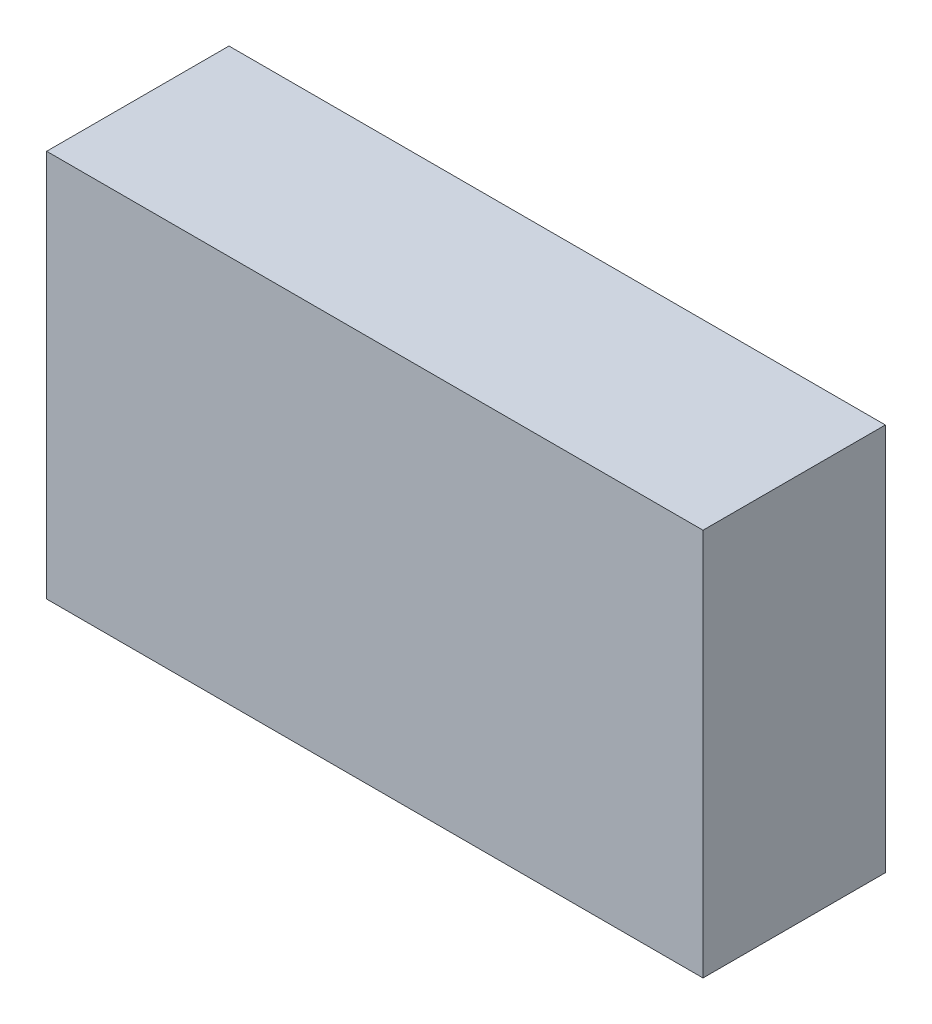
ISO-10303-21;
HEADER;
FILE_DESCRIPTION(('STEP AP214'),'2;1');
FILE_NAME('part.step','',(''),(''),'','','');
FILE_SCHEMA(('AUTOMOTIVE_DESIGN { 1 0 10303 214 1 1 1 1 }'));
ENDSEC;
DATA;
#1=APPLICATION_CONTEXT('core data for automotive mechanical design processes');
#2=APPLICATION_PROTOCOL_DEFINITION('international standard','automotive_design',2000,#1);
#3=PRODUCT_CONTEXT('',#1,'mechanical');
#4=PRODUCT('Part','Part','',(#3));
#5=PRODUCT_RELATED_PRODUCT_CATEGORY('part','',(#4));
#6=PRODUCT_DEFINITION_FORMATION('','',#4);
#7=PRODUCT_DEFINITION_CONTEXT('part definition',#1,'design');
#8=PRODUCT_DEFINITION('design','',#6,#7);
#9=PRODUCT_DEFINITION_SHAPE('','',#8);
#10=(LENGTH_UNIT() NAMED_UNIT(*) SI_UNIT(.MILLI.,.METRE.));
#11=(NAMED_UNIT(*) PLANE_ANGLE_UNIT() SI_UNIT($,.RADIAN.));
#12=(NAMED_UNIT(*) SI_UNIT($,.STERADIAN.) SOLID_ANGLE_UNIT());
#13=UNCERTAINTY_MEASURE_WITH_UNIT(LENGTH_MEASURE(1.E-05),#10,'distance_accuracy_value','');
#14=(GEOMETRIC_REPRESENTATION_CONTEXT(3) GLOBAL_UNCERTAINTY_ASSIGNED_CONTEXT((#13)) GLOBAL_UNIT_ASSIGNED_CONTEXT((#10,
#11,#12)) REPRESENTATION_CONTEXT('',''));
#15=CARTESIAN_POINT('',(0.,0.,0.));
#16=DIRECTION('',(0.,0.,1.));
#17=DIRECTION('',(1.,0.,0.));
#18=AXIS2_PLACEMENT_3D('',#15,#16,#17);
#19=CARTESIAN_POINT('',(-1.8,-1.0635,1.));
#20=DIRECTION('',(1.,0.,0.));
#21=DIRECTION('',(0.,0.,-1.));
#22=AXIS2_PLACEMENT_3D('',#19,#20,#21);
#23=PLANE('',#22);
#24=DIRECTION('',(0.,-1.,0.));
#25=VECTOR('',#24,1.);
#26=CARTESIAN_POINT('',(-1.8,-1.0635,0.));
#27=LINE('',#26,#25);
#28=CARTESIAN_POINT('',(-1.8,1.0635,0.));
#29=VERTEX_POINT('',#28);
#30=CARTESIAN_POINT('',(-1.8,-1.0635,0.));
#31=VERTEX_POINT('',#30);
#32=EDGE_CURVE('E95',#29,#31,#27,.T.);
#33=ORIENTED_EDGE('',*,*,#32,.T.);
#34=DIRECTION('',(0.,0.,-1.));
#35=VECTOR('',#34,1.);
#36=CARTESIAN_POINT('',(-1.8,-1.0635,1.));
#37=LINE('',#36,#35);
#38=CARTESIAN_POINT('',(-1.8,-1.0635,1.));
#39=VERTEX_POINT('',#38);
#40=EDGE_CURVE('E11',#39,#31,#37,.T.);
#41=ORIENTED_EDGE('',*,*,#40,.F.);
#42=DIRECTION('',(0.,-1.,0.));
#43=VECTOR('',#42,1.);
#44=CARTESIAN_POINT('',(-1.8,-1.0635,1.));
#45=LINE('',#44,#43);
#46=CARTESIAN_POINT('',(-1.8,1.0635,1.));
#47=VERTEX_POINT('',#46);
#48=EDGE_CURVE('E83',#47,#39,#45,.T.);
#49=ORIENTED_EDGE('',*,*,#48,.F.);
#50=DIRECTION('',(0.,0.,-1.));
#51=VECTOR('',#50,1.);
#52=CARTESIAN_POINT('',(-1.8,1.0635,1.));
#53=LINE('',#52,#51);
#54=EDGE_CURVE('E91',#47,#29,#53,.T.);
#55=ORIENTED_EDGE('',*,*,#54,.T.);
#56=EDGE_LOOP('',(#33,#41,#49,#55));
#57=FACE_BOUND('',#56,.T.);
#58=ADVANCED_FACE('F32',(#57),#23,.F.);
#59=CARTESIAN_POINT('',(1.8,-1.0635,1.));
#60=DIRECTION('',(0.,1.,0.));
#61=DIRECTION('',(0.,0.,1.));
#62=AXIS2_PLACEMENT_3D('',#59,#60,#61);
#63=PLANE('',#62);
#64=DIRECTION('',(1.,0.,0.));
#65=VECTOR('',#64,1.);
#66=CARTESIAN_POINT('',(1.8,-1.0635,0.));
#67=LINE('',#66,#65);
#68=CARTESIAN_POINT('',(1.8,-1.0635,0.));
#69=VERTEX_POINT('',#68);
#70=EDGE_CURVE('E87',#31,#69,#67,.T.);
#71=ORIENTED_EDGE('',*,*,#70,.T.);
#72=DIRECTION('',(0.,0.,-1.));
#73=VECTOR('',#72,1.);
#74=CARTESIAN_POINT('',(1.8,-1.0635,1.));
#75=LINE('',#74,#73);
#76=CARTESIAN_POINT('',(1.8,-1.0635,1.));
#77=VERTEX_POINT('',#76);
#78=EDGE_CURVE('E40',#77,#69,#75,.T.);
#79=ORIENTED_EDGE('',*,*,#78,.F.);
#80=DIRECTION('',(1.,0.,0.));
#81=VECTOR('',#80,1.);
#82=CARTESIAN_POINT('',(1.8,-1.0635,1.));
#83=LINE('',#82,#81);
#84=EDGE_CURVE('E78',#39,#77,#83,.T.);
#85=ORIENTED_EDGE('',*,*,#84,.F.);
#86=ORIENTED_EDGE('',*,*,#40,.T.);
#87=EDGE_LOOP('',(#71,#79,#85,#86));
#88=FACE_BOUND('',#87,.T.);
#89=ADVANCED_FACE('F86',(#88),#63,.F.);
#90=CARTESIAN_POINT('',(1.8,1.0635,1.));
#91=DIRECTION('',(-1.,0.,0.));
#92=DIRECTION('',(0.,0.,1.));
#93=AXIS2_PLACEMENT_3D('',#90,#91,#92);
#94=PLANE('',#93);
#95=DIRECTION('',(0.,1.,0.));
#96=VECTOR('',#95,1.);
#97=CARTESIAN_POINT('',(1.8,1.0635,0.));
#98=LINE('',#97,#96);
#99=CARTESIAN_POINT('',(1.8,1.0635,0.));
#100=VERTEX_POINT('',#99);
#101=EDGE_CURVE('E65',#69,#100,#98,.T.);
#102=ORIENTED_EDGE('',*,*,#101,.T.);
#103=DIRECTION('',(0.,0.,-1.));
#104=VECTOR('',#103,1.);
#105=CARTESIAN_POINT('',(1.8,1.0635,1.));
#106=LINE('',#105,#104);
#107=CARTESIAN_POINT('',(1.8,1.0635,1.));
#108=VERTEX_POINT('',#107);
#109=EDGE_CURVE('E88',#108,#100,#106,.T.);
#110=ORIENTED_EDGE('',*,*,#109,.F.);
#111=DIRECTION('',(0.,1.,0.));
#112=VECTOR('',#111,1.);
#113=CARTESIAN_POINT('',(1.8,1.0635,1.));
#114=LINE('',#113,#112);
#115=EDGE_CURVE('E81',#77,#108,#114,.T.);
#116=ORIENTED_EDGE('',*,*,#115,.F.);
#117=ORIENTED_EDGE('',*,*,#78,.T.);
#118=EDGE_LOOP('',(#102,#110,#116,#117));
#119=FACE_BOUND('',#118,.T.);
#120=ADVANCED_FACE('F89',(#119),#94,.F.);
#121=CARTESIAN_POINT('',(-1.8,1.0635,1.));
#122=DIRECTION('',(0.,-1.,0.));
#123=DIRECTION('',(0.,0.,-1.));
#124=AXIS2_PLACEMENT_3D('',#121,#122,#123);
#125=PLANE('',#124);
#126=DIRECTION('',(-1.,0.,0.));
#127=VECTOR('',#126,1.);
#128=CARTESIAN_POINT('',(-1.8,1.0635,0.));
#129=LINE('',#128,#127);
#130=EDGE_CURVE('E71',#100,#29,#129,.T.);
#131=ORIENTED_EDGE('',*,*,#130,.T.);
#132=ORIENTED_EDGE('',*,*,#54,.F.);
#133=DIRECTION('',(-1.,0.,0.));
#134=VECTOR('',#133,1.);
#135=CARTESIAN_POINT('',(-1.8,1.0635,1.));
#136=LINE('',#135,#134);
#137=EDGE_CURVE('E48',#108,#47,#136,.T.);
#138=ORIENTED_EDGE('',*,*,#137,.F.);
#139=ORIENTED_EDGE('',*,*,#109,.T.);
#140=EDGE_LOOP('',(#131,#132,#138,#139));
#141=FACE_BOUND('',#140,.T.);
#142=ADVANCED_FACE('F102',(#141),#125,.F.);
#143=CARTESIAN_POINT('',(0.,0.,1.));
#144=DIRECTION('',(0.,0.,-1.));
#145=DIRECTION('',(-1.,0.,0.));
#146=AXIS2_PLACEMENT_3D('',#143,#144,#145);
#147=PLANE('',#146);
#148=ORIENTED_EDGE('',*,*,#48,.T.);
#149=ORIENTED_EDGE('',*,*,#84,.T.);
#150=ORIENTED_EDGE('',*,*,#115,.T.);
#151=ORIENTED_EDGE('',*,*,#137,.T.);
#152=EDGE_LOOP('',(#148,#149,#150,#151));
#153=FACE_BOUND('',#152,.T.);
#154=ADVANCED_FACE('F79',(#153),#147,.F.);
#155=CARTESIAN_POINT('',(0.,0.,0.));
#156=DIRECTION('',(0.,0.,-1.));
#157=DIRECTION('',(-1.,0.,0.));
#158=AXIS2_PLACEMENT_3D('',#155,#156,#157);
#159=PLANE('',#158);
#160=ORIENTED_EDGE('',*,*,#32,.F.);
#161=ORIENTED_EDGE('',*,*,#130,.F.);
#162=ORIENTED_EDGE('',*,*,#101,.F.);
#163=ORIENTED_EDGE('',*,*,#70,.F.);
#164=EDGE_LOOP('',(#160,#161,#162,#163));
#165=FACE_BOUND('',#164,.T.);
#166=ADVANCED_FACE('F105',(#165),#159,.T.);
#167=CLOSED_SHELL('',(#58,#89,#120,#142,#154,#166));
#168=MANIFOLD_SOLID_BREP('B2',#167);
#169=ADVANCED_BREP_SHAPE_REPRESENTATION('',(#18,#168),#14);
#170=SHAPE_DEFINITION_REPRESENTATION(#9,#169);
ENDSEC;
END-ISO-10303-21;
